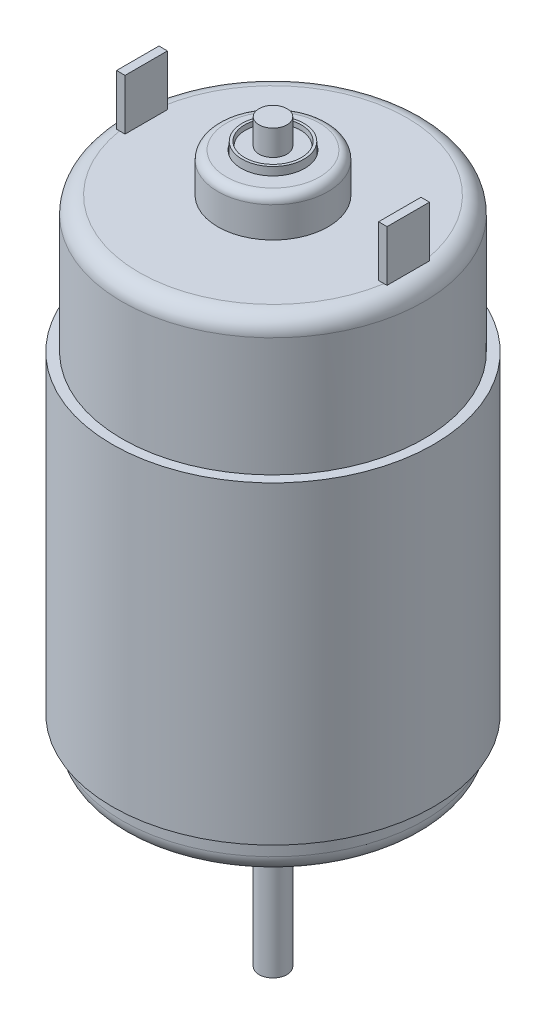
ISO-10303-21;
HEADER;
FILE_DESCRIPTION(('STEP AP214'),'2;1');
FILE_NAME('part.step','',(''),(''),'','','');
FILE_SCHEMA(('AUTOMOTIVE_DESIGN { 1 0 10303 214 1 1 1 1 }'));
ENDSEC;
DATA;
#1=APPLICATION_CONTEXT('core data for automotive mechanical design processes');
#2=APPLICATION_PROTOCOL_DEFINITION('international standard','automotive_design',2000,#1);
#3=PRODUCT_CONTEXT('',#1,'mechanical');
#4=PRODUCT('Part','Part','',(#3));
#5=PRODUCT_RELATED_PRODUCT_CATEGORY('part','',(#4));
#6=PRODUCT_DEFINITION_FORMATION('','',#4);
#7=PRODUCT_DEFINITION_CONTEXT('part definition',#1,'design');
#8=PRODUCT_DEFINITION('design','',#6,#7);
#9=PRODUCT_DEFINITION_SHAPE('','',#8);
#10=(LENGTH_UNIT() NAMED_UNIT(*) SI_UNIT(.MILLI.,.METRE.));
#11=(NAMED_UNIT(*) PLANE_ANGLE_UNIT() SI_UNIT($,.RADIAN.));
#12=(NAMED_UNIT(*) SI_UNIT($,.STERADIAN.) SOLID_ANGLE_UNIT());
#13=UNCERTAINTY_MEASURE_WITH_UNIT(LENGTH_MEASURE(1.E-05),#10,'distance_accuracy_value','');
#14=(GEOMETRIC_REPRESENTATION_CONTEXT(3) GLOBAL_UNCERTAINTY_ASSIGNED_CONTEXT((#13)) GLOBAL_UNIT_ASSIGNED_CONTEXT((#10,
#11,#12)) REPRESENTATION_CONTEXT('',''));
#15=CARTESIAN_POINT('',(0.,0.,0.));
#16=DIRECTION('',(0.,0.,1.));
#17=DIRECTION('',(1.,0.,0.));
#18=AXIS2_PLACEMENT_3D('',#15,#16,#17);
#19=CARTESIAN_POINT('',(0.,57.,0.));
#20=DIRECTION('',(0.,1.,0.));
#21=DIRECTION('',(0.,0.,1.));
#22=AXIS2_PLACEMENT_3D('',#19,#20,#21);
#23=PLANE('',#22);
#24=CARTESIAN_POINT('',(0.,57.,0.));
#25=DIRECTION('',(0.,1.,0.));
#26=DIRECTION('',(0.,0.,1.));
#27=AXIS2_PLACEMENT_3D('',#24,#25,#26);
#28=CIRCLE('',#27,6.5);
#29=CARTESIAN_POINT('',(0.,57.,6.5));
#30=VERTEX_POINT('',#29);
#31=EDGE_CURVE('E221',#30,#30,#28,.T.);
#32=ORIENTED_EDGE('',*,*,#31,.F.);
#33=EDGE_LOOP('',(#32));
#34=FACE_BOUND('',#33,.T.);
#35=DIRECTION('',(0.,0.,-1.));
#36=VECTOR('',#35,1.);
#37=CARTESIAN_POINT('',(-14.95,57.,-2.5));
#38=LINE('',#37,#36);
#39=CARTESIAN_POINT('',(-14.95,57.,2.5));
#40=VERTEX_POINT('',#39);
#41=CARTESIAN_POINT('',(-14.95,57.,-2.5));
#42=VERTEX_POINT('',#41);
#43=EDGE_CURVE('E50',#40,#42,#38,.T.);
#44=ORIENTED_EDGE('',*,*,#43,.F.);
#45=DIRECTION('',(1.,0.,0.));
#46=VECTOR('',#45,1.);
#47=CARTESIAN_POINT('',(-15.95,57.,2.5));
#48=LINE('',#47,#46);
#49=CARTESIAN_POINT('',(-15.6009615088302,57.,2.5));
#50=VERTEX_POINT('',#49);
#51=EDGE_CURVE('E310',#50,#40,#48,.T.);
#52=ORIENTED_EDGE('',*,*,#51,.F.);
#53=CARTESIAN_POINT('',(0.,57.,0.));
#54=DIRECTION('',(0.,1.,0.));
#55=DIRECTION('',(0.,0.,1.));
#56=AXIS2_PLACEMENT_3D('',#53,#54,#55);
#57=CIRCLE('',#56,15.8);
#58=CARTESIAN_POINT('',(15.6009615088302,57.,2.5));
#59=VERTEX_POINT('',#58);
#60=EDGE_CURVE('E233',#50,#59,#57,.T.);
#61=ORIENTED_EDGE('',*,*,#60,.T.);
#62=DIRECTION('',(1.,0.,0.));
#63=VECTOR('',#62,1.);
#64=CARTESIAN_POINT('',(15.95,57.,2.5));
#65=LINE('',#64,#63);
#66=CARTESIAN_POINT('',(14.95,57.,2.5));
#67=VERTEX_POINT('',#66);
#68=EDGE_CURVE('E157',#67,#59,#65,.T.);
#69=ORIENTED_EDGE('',*,*,#68,.F.);
#70=DIRECTION('',(0.,0.,1.));
#71=VECTOR('',#70,1.);
#72=CARTESIAN_POINT('',(14.95,57.,-2.5));
#73=LINE('',#72,#71);
#74=CARTESIAN_POINT('',(14.95,57.,-2.5));
#75=VERTEX_POINT('',#74);
#76=EDGE_CURVE('E137',#75,#67,#73,.T.);
#77=ORIENTED_EDGE('',*,*,#76,.F.);
#78=DIRECTION('',(-1.,0.,0.));
#79=VECTOR('',#78,1.);
#80=CARTESIAN_POINT('',(15.95,57.,-2.5));
#81=LINE('',#80,#79);
#82=CARTESIAN_POINT('',(15.6009615088302,57.,-2.5));
#83=VERTEX_POINT('',#82);
#84=EDGE_CURVE('E162',#83,#75,#81,.T.);
#85=ORIENTED_EDGE('',*,*,#84,.F.);
#86=CARTESIAN_POINT('',(-15.6009615088302,57.,-2.5));
#87=VERTEX_POINT('',#86);
#88=EDGE_CURVE('E238',#83,#87,#57,.T.);
#89=ORIENTED_EDGE('',*,*,#88,.T.);
#90=DIRECTION('',(-1.,0.,0.));
#91=VECTOR('',#90,1.);
#92=CARTESIAN_POINT('',(-15.95,57.,-2.5));
#93=LINE('',#92,#91);
#94=EDGE_CURVE('E55',#42,#87,#93,.T.);
#95=ORIENTED_EDGE('',*,*,#94,.F.);
#96=EDGE_LOOP('',(#44,#52,#61,#69,#77,#85,#89,#95));
#97=FACE_BOUND('',#96,.T.);
#98=ADVANCED_FACE('F35',(#34,#97),#23,.T.);
#99=CARTESIAN_POINT('',(0.,57.,0.));
#100=DIRECTION('',(0.,-1.,0.));
#101=DIRECTION('',(0.,0.,-1.));
#102=AXIS2_PLACEMENT_3D('',#99,#100,#101);
#103=CYLINDRICAL_SURFACE('',#102,17.8);
#104=CARTESIAN_POINT('',(0.,41.,0.));
#105=DIRECTION('',(0.,1.,0.));
#106=DIRECTION('',(0.,0.,1.));
#107=AXIS2_PLACEMENT_3D('',#104,#105,#106);
#108=CIRCLE('',#107,17.8);
#109=CARTESIAN_POINT('',(0.,41.,-17.8));
#110=VERTEX_POINT('',#109);
#111=EDGE_CURVE('E186',#110,#110,#108,.T.);
#112=CARTESIAN_POINT('',(0.,55.,0.));
#113=DIRECTION('',(0.,1.,0.));
#114=DIRECTION('',(0.,0.,1.));
#115=AXIS2_PLACEMENT_3D('',#112,#113,#114);
#116=CIRCLE('',#115,17.8);
#117=CARTESIAN_POINT('',(0.,55.,-17.8));
#118=VERTEX_POINT('',#117);
#119=EDGE_CURVE('E224',#118,#118,#116,.F.);
#120=CARTESIAN_POINT('',(0.,41.,-17.8));
#121=CARTESIAN_POINT('',(0.,41.1458333333333,-17.8));
#122=CARTESIAN_POINT('',(0.,41.2916666666667,-17.8));
#123=CARTESIAN_POINT('',(0.,41.5833333333333,-17.8));
#124=CARTESIAN_POINT('',(0.,41.7291666666667,-17.8));
#125=CARTESIAN_POINT('',(0.,42.0208333333333,-17.8));
#126=CARTESIAN_POINT('',(0.,42.1666666666667,-17.8));
#127=CARTESIAN_POINT('',(0.,42.4583333333333,-17.8));
#128=CARTESIAN_POINT('',(0.,42.6041666666667,-17.8));
#129=CARTESIAN_POINT('',(0.,42.8958333333333,-17.8));
#130=CARTESIAN_POINT('',(0.,43.0416666666667,-17.8));
#131=CARTESIAN_POINT('',(0.,43.3333333333333,-17.8));
#132=CARTESIAN_POINT('',(0.,43.4791666666667,-17.8));
#133=CARTESIAN_POINT('',(0.,43.7708333333333,-17.8));
#134=CARTESIAN_POINT('',(0.,43.9166666666667,-17.8));
#135=CARTESIAN_POINT('',(0.,44.2083333333333,-17.8));
#136=CARTESIAN_POINT('',(0.,44.3541666666667,-17.8));
#137=CARTESIAN_POINT('',(0.,44.6458333333333,-17.8));
#138=CARTESIAN_POINT('',(0.,44.7916666666667,-17.8));
#139=CARTESIAN_POINT('',(0.,45.0833333333333,-17.8));
#140=CARTESIAN_POINT('',(0.,45.2291666666667,-17.8));
#141=CARTESIAN_POINT('',(0.,45.5208333333333,-17.8));
#142=CARTESIAN_POINT('',(0.,45.6666666666667,-17.8));
#143=CARTESIAN_POINT('',(0.,45.9583333333333,-17.8));
#144=CARTESIAN_POINT('',(0.,46.1041666666667,-17.8));
#145=CARTESIAN_POINT('',(0.,46.3958333333333,-17.8));
#146=CARTESIAN_POINT('',(0.,46.5416666666667,-17.8));
#147=CARTESIAN_POINT('',(0.,46.8333333333333,-17.8));
#148=CARTESIAN_POINT('',(0.,46.9791666666667,-17.8));
#149=CARTESIAN_POINT('',(0.,47.2708333333333,-17.8));
#150=CARTESIAN_POINT('',(0.,47.4166666666667,-17.8));
#151=CARTESIAN_POINT('',(0.,47.7083333333333,-17.8));
#152=CARTESIAN_POINT('',(0.,47.8541666666667,-17.8));
#153=CARTESIAN_POINT('',(0.,48.1458333333333,-17.8));
#154=CARTESIAN_POINT('',(0.,48.2916666666667,-17.8));
#155=CARTESIAN_POINT('',(0.,48.5833333333333,-17.8));
#156=CARTESIAN_POINT('',(0.,48.7291666666667,-17.8));
#157=CARTESIAN_POINT('',(0.,49.0208333333333,-17.8));
#158=CARTESIAN_POINT('',(0.,49.1666666666667,-17.8));
#159=CARTESIAN_POINT('',(0.,49.4583333333333,-17.8));
#160=CARTESIAN_POINT('',(0.,49.6041666666667,-17.8));
#161=CARTESIAN_POINT('',(0.,49.8958333333333,-17.8));
#162=CARTESIAN_POINT('',(0.,50.0416666666667,-17.8));
#163=CARTESIAN_POINT('',(0.,50.3333333333333,-17.8));
#164=CARTESIAN_POINT('',(0.,50.4791666666667,-17.8));
#165=CARTESIAN_POINT('',(0.,50.7708333333333,-17.8));
#166=CARTESIAN_POINT('',(0.,50.9166666666667,-17.8));
#167=CARTESIAN_POINT('',(0.,51.2083333333333,-17.8));
#168=CARTESIAN_POINT('',(0.,51.3541666666667,-17.8));
#169=CARTESIAN_POINT('',(0.,51.6458333333333,-17.8));
#170=CARTESIAN_POINT('',(0.,51.7916666666667,-17.8));
#171=CARTESIAN_POINT('',(0.,52.0833333333333,-17.8));
#172=CARTESIAN_POINT('',(0.,52.2291666666667,-17.8));
#173=CARTESIAN_POINT('',(0.,52.5208333333333,-17.8));
#174=CARTESIAN_POINT('',(0.,52.6666666666667,-17.8));
#175=CARTESIAN_POINT('',(0.,52.9583333333333,-17.8));
#176=CARTESIAN_POINT('',(0.,53.1041666666667,-17.8));
#177=CARTESIAN_POINT('',(0.,53.3958333333333,-17.8));
#178=CARTESIAN_POINT('',(0.,53.5416666666667,-17.8));
#179=CARTESIAN_POINT('',(0.,53.8333333333333,-17.8));
#180=CARTESIAN_POINT('',(0.,53.9791666666667,-17.8));
#181=CARTESIAN_POINT('',(0.,54.2708333333333,-17.8));
#182=CARTESIAN_POINT('',(0.,54.4166666666667,-17.8));
#183=CARTESIAN_POINT('',(0.,54.7083333333333,-17.8));
#184=CARTESIAN_POINT('',(0.,54.8541666666667,-17.8));
#185=CARTESIAN_POINT('',(0.,55.,-17.8));
#186=B_SPLINE_CURVE_WITH_KNOTS('',3,(#120,#121,#122,#123,#124,#125,#126,#127,#128,#129,#130,
#131,#132,#133,#134,#135,#136,#137,#138,#139,#140,#141,#142,#143,#144,#145,#146,#147,#148,#149,
#150,#151,#152,#153,#154,#155,#156,#157,#158,#159,#160,#161,#162,#163,#164,#165,#166,#167,#168,
#169,#170,#171,#172,#173,#174,#175,#176,#177,#178,#179,#180,#181,#182,#183,#184,#185),
.UNSPECIFIED.,.F.,.F.,(4,2,2,2,2,2,2,2,2,2,2,2,2,2,2,2,2,2,2,2,2,2,2,2,2,2,2,2,2,2,2,2,4),(0.,
0.4375,0.875000000000001,1.3125,1.75,2.1875,2.625,3.0625,3.5,3.9375,4.375,4.8125,5.25,
5.68750000000001,6.12500000000001,6.5625,7.00000000000001,7.4375,7.87500000000001,8.3125,8.75,
9.1875,9.625,10.0625,10.5,10.9375,11.375,11.8125,12.25,12.6875,13.125,13.5625,14.),.UNSPECIFIED.);
#187=EDGE_CURVE('BSEAM268',#110,#118,#186,.T.);
#188=ORIENTED_EDGE('',*,*,#111,.T.);
#189=ORIENTED_EDGE('',*,*,#119,.T.);
#190=ORIENTED_EDGE('',*,*,#187,.T.);
#191=ORIENTED_EDGE('',*,*,#187,.F.);
#192=EDGE_LOOP('',(#188,#190,#189,#191));
#193=FACE_BOUND('',#192,.T.);
#194=ADVANCED_FACE('F268',(#193),#103,.T.);
#195=CARTESIAN_POINT('',(0.,55.,0.));
#196=DIRECTION('',(0.,1.,0.));
#197=DIRECTION('',(0.,0.,1.));
#198=AXIS2_PLACEMENT_3D('',#195,#196,#197);
#199=TOROIDAL_SURFACE('',#198,15.8,2.);
#200=ORIENTED_EDGE('',*,*,#119,.F.);
#201=EDGE_LOOP('',(#200));
#202=FACE_BOUND('',#201,.T.);
#203=EDGE_CURVE('E234',#59,#83,#57,.T.);
#204=ORIENTED_EDGE('',*,*,#203,.F.);
#205=ORIENTED_EDGE('',*,*,#60,.F.);
#206=EDGE_CURVE('E312',#87,#50,#57,.T.);
#207=ORIENTED_EDGE('',*,*,#206,.F.);
#208=ORIENTED_EDGE('',*,*,#88,.F.);
#209=EDGE_LOOP('',(#204,#205,#207,#208));
#210=FACE_BOUND('',#209,.T.);
#211=ADVANCED_FACE('F274',(#202,#210),#199,.T.);
#212=CARTESIAN_POINT('',(0.,61.6,0.));
#213=DIRECTION('',(0.,1.,0.));
#214=DIRECTION('',(0.,0.,1.));
#215=AXIS2_PLACEMENT_3D('',#212,#213,#214);
#216=PLANE('',#215);
#217=CARTESIAN_POINT('',(0.,61.6,0.));
#218=DIRECTION('',(0.,1.,0.));
#219=DIRECTION('',(0.,0.,1.));
#220=AXIS2_PLACEMENT_3D('',#217,#218,#219);
#221=CIRCLE('',#220,5.5);
#222=CARTESIAN_POINT('',(0.,61.6,5.5));
#223=VERTEX_POINT('',#222);
#224=EDGE_CURVE('E43',#223,#223,#221,.T.);
#225=ORIENTED_EDGE('',*,*,#224,.T.);
#226=EDGE_LOOP('',(#225));
#227=FACE_BOUND('',#226,.T.);
#228=CARTESIAN_POINT('',(0.,61.6,0.));
#229=DIRECTION('',(0.,1.,0.));
#230=DIRECTION('',(0.,0.,1.));
#231=AXIS2_PLACEMENT_3D('',#228,#229,#230);
#232=CIRCLE('',#231,3.75);
#233=CARTESIAN_POINT('',(0.,61.6,3.75));
#234=VERTEX_POINT('',#233);
#235=EDGE_CURVE('E216',#234,#234,#232,.T.);
#236=ORIENTED_EDGE('',*,*,#235,.F.);
#237=EDGE_LOOP('',(#236));
#238=FACE_BOUND('',#237,.T.);
#239=ADVANCED_FACE('F249',(#227,#238),#216,.T.);
#240=CARTESIAN_POINT('',(0.,61.6,0.));
#241=DIRECTION('',(0.,-1.,0.));
#242=DIRECTION('',(0.,0.,-1.));
#243=AXIS2_PLACEMENT_3D('',#240,#241,#242);
#244=CYLINDRICAL_SURFACE('',#243,6.5);
#245=CARTESIAN_POINT('',(0.,60.6,0.));
#246=DIRECTION('',(0.,1.,0.));
#247=DIRECTION('',(0.,0.,1.));
#248=AXIS2_PLACEMENT_3D('',#245,#246,#247);
#249=CIRCLE('',#248,6.5);
#250=CARTESIAN_POINT('',(0.,60.6,6.5));
#251=VERTEX_POINT('',#250);
#252=EDGE_CURVE('E11',#251,#251,#249,.F.);
#253=ORIENTED_EDGE('',*,*,#252,.T.);
#254=EDGE_LOOP('',(#253));
#255=FACE_BOUND('',#254,.T.);
#256=ORIENTED_EDGE('',*,*,#31,.T.);
#257=EDGE_LOOP('',(#256));
#258=FACE_BOUND('',#257,.T.);
#259=ADVANCED_FACE('F281',(#255,#258),#244,.T.);
#260=CARTESIAN_POINT('',(0.,61.6,0.));
#261=DIRECTION('',(0.,-1.,0.));
#262=DIRECTION('',(0.,0.,-1.));
#263=AXIS2_PLACEMENT_3D('',#260,#261,#262);
#264=CYLINDRICAL_SURFACE('',#263,3.75);
#265=ORIENTED_EDGE('',*,*,#235,.T.);
#266=EDGE_LOOP('',(#265));
#267=FACE_BOUND('',#266,.T.);
#268=CARTESIAN_POINT('',(0.,57.,0.));
#269=DIRECTION('',(0.,1.,0.));
#270=DIRECTION('',(0.,0.,1.));
#271=AXIS2_PLACEMENT_3D('',#268,#269,#270);
#272=CIRCLE('',#271,3.75);
#273=CARTESIAN_POINT('',(0.,57.,3.75));
#274=VERTEX_POINT('',#273);
#275=EDGE_CURVE('E210',#274,#274,#272,.T.);
#276=ORIENTED_EDGE('',*,*,#275,.F.);
#277=EDGE_LOOP('',(#276));
#278=FACE_BOUND('',#277,.T.);
#279=ADVANCED_FACE('F410',(#267,#278),#264,.F.);
#280=CARTESIAN_POINT('',(0.,62.5,0.));
#281=DIRECTION('',(0.,1.,0.));
#282=DIRECTION('',(0.,0.,1.));
#283=AXIS2_PLACEMENT_3D('',#280,#281,#282);
#284=PLANE('',#283);
#285=CARTESIAN_POINT('',(0.,62.5,0.));
#286=DIRECTION('',(0.,1.,0.));
#287=DIRECTION('',(0.,0.,1.));
#288=AXIS2_PLACEMENT_3D('',#285,#286,#287);
#289=CIRCLE('',#288,3.6539971428948);
#290=CARTESIAN_POINT('',(0.,62.5,3.6539971428948));
#291=VERTEX_POINT('',#290);
#292=EDGE_CURVE('E213',#291,#291,#289,.T.);
#293=ORIENTED_EDGE('',*,*,#292,.T.);
#294=EDGE_LOOP('',(#293));
#295=FACE_BOUND('',#294,.T.);
#296=CARTESIAN_POINT('',(0.,62.5,0.));
#297=DIRECTION('',(0.,1.,0.));
#298=DIRECTION('',(0.,0.,1.));
#299=AXIS2_PLACEMENT_3D('',#296,#297,#298);
#300=CIRCLE('',#299,3.3460028571052);
#301=CARTESIAN_POINT('',(0.,62.5,3.3460028571052));
#302=VERTEX_POINT('',#301);
#303=EDGE_CURVE('E209',#302,#302,#300,.T.);
#304=ORIENTED_EDGE('',*,*,#303,.F.);
#305=EDGE_LOOP('',(#304));
#306=FACE_BOUND('',#305,.T.);
#307=ADVANCED_FACE('F406',(#295,#306),#284,.T.);
#308=CARTESIAN_POINT('',(0.,57.,0.));
#309=DIRECTION('',(0.,-1.,0.));
#310=DIRECTION('',(0.,0.,1.));
#311=AXIS2_PLACEMENT_3D('',#308,#309,#310);
#312=CONICAL_SURFACE('',#311,3.75,0.0174532925199433);
#313=ORIENTED_EDGE('',*,*,#292,.F.);
#314=EDGE_LOOP('',(#313));
#315=FACE_BOUND('',#314,.T.);
#316=ORIENTED_EDGE('',*,*,#275,.T.);
#317=EDGE_LOOP('',(#316));
#318=FACE_BOUND('',#317,.T.);
#319=ADVANCED_FACE('F409',(#315,#318),#312,.T.);
#320=CARTESIAN_POINT('',(0.,57.,0.));
#321=DIRECTION('',(0.,1.,0.));
#322=DIRECTION('',(0.,0.,1.));
#323=AXIS2_PLACEMENT_3D('',#320,#321,#322);
#324=CONICAL_SURFACE('',#323,3.25,0.0174532925199433);
#325=ORIENTED_EDGE('',*,*,#303,.T.);
#326=EDGE_LOOP('',(#325));
#327=FACE_BOUND('',#326,.T.);
#328=CARTESIAN_POINT('',(0.,57.,0.));
#329=DIRECTION('',(0.,1.,0.));
#330=DIRECTION('',(0.,0.,1.));
#331=AXIS2_PLACEMENT_3D('',#328,#329,#330);
#332=CIRCLE('',#331,3.25);
#333=CARTESIAN_POINT('',(0.,57.,3.25));
#334=VERTEX_POINT('',#333);
#335=EDGE_CURVE('E180',#334,#334,#332,.T.);
#336=ORIENTED_EDGE('',*,*,#335,.F.);
#337=EDGE_LOOP('',(#336));
#338=FACE_BOUND('',#337,.T.);
#339=ADVANCED_FACE('F382',(#327,#338),#324,.F.);
#340=CARTESIAN_POINT('',(0.,4.,0.));
#341=DIRECTION('',(0.,1.,0.));
#342=DIRECTION('',(0.,0.,1.));
#343=AXIS2_PLACEMENT_3D('',#340,#341,#342);
#344=CYLINDRICAL_SURFACE('',#343,18.95);
#345=CARTESIAN_POINT('',(0.,4.,0.));
#346=DIRECTION('',(0.,1.,0.));
#347=DIRECTION('',(0.,0.,1.));
#348=AXIS2_PLACEMENT_3D('',#345,#346,#347);
#349=CIRCLE('',#348,18.95);
#350=CARTESIAN_POINT('',(0.,4.,18.95));
#351=VERTEX_POINT('',#350);
#352=EDGE_CURVE('E192',#351,#351,#349,.T.);
#353=ORIENTED_EDGE('',*,*,#352,.T.);
#354=EDGE_LOOP('',(#353));
#355=FACE_BOUND('',#354,.T.);
#356=CARTESIAN_POINT('',(0.,41.,0.));
#357=DIRECTION('',(0.,1.,0.));
#358=DIRECTION('',(0.,0.,1.));
#359=AXIS2_PLACEMENT_3D('',#356,#357,#358);
#360=CIRCLE('',#359,18.95);
#361=CARTESIAN_POINT('',(0.,41.,18.95));
#362=VERTEX_POINT('',#361);
#363=EDGE_CURVE('E191',#362,#362,#360,.T.);
#364=ORIENTED_EDGE('',*,*,#363,.F.);
#365=EDGE_LOOP('',(#364));
#366=FACE_BOUND('',#365,.T.);
#367=ADVANCED_FACE('F374',(#355,#366),#344,.T.);
#368=CARTESIAN_POINT('',(0.,4.,0.));
#369=DIRECTION('',(0.,1.,0.));
#370=DIRECTION('',(0.,0.,1.));
#371=AXIS2_PLACEMENT_3D('',#368,#369,#370);
#372=PLANE('',#371);
#373=CARTESIAN_POINT('',(0.,4.,0.));
#374=DIRECTION('',(0.,1.,0.));
#375=DIRECTION('',(0.,0.,1.));
#376=AXIS2_PLACEMENT_3D('',#373,#374,#375);
#377=CIRCLE('',#376,17.8);
#378=CARTESIAN_POINT('',(0.,4.,-17.8));
#379=VERTEX_POINT('',#378);
#380=EDGE_CURVE('E244',#379,#379,#377,.T.);
#381=ORIENTED_EDGE('',*,*,#380,.T.);
#382=EDGE_LOOP('',(#381));
#383=FACE_BOUND('',#382,.T.);
#384=ORIENTED_EDGE('',*,*,#352,.F.);
#385=EDGE_LOOP('',(#384));
#386=FACE_BOUND('',#385,.T.);
#387=ADVANCED_FACE('F370',(#383,#386),#372,.F.);
#388=CARTESIAN_POINT('',(0.,41.,0.));
#389=DIRECTION('',(0.,1.,0.));
#390=DIRECTION('',(0.,0.,1.));
#391=AXIS2_PLACEMENT_3D('',#388,#389,#390);
#392=PLANE('',#391);
#393=ORIENTED_EDGE('',*,*,#111,.F.);
#394=EDGE_LOOP('',(#393));
#395=FACE_BOUND('',#394,.T.);
#396=ORIENTED_EDGE('',*,*,#363,.T.);
#397=EDGE_LOOP('',(#396));
#398=FACE_BOUND('',#397,.T.);
#399=ADVANCED_FACE('F373',(#395,#398),#392,.T.);
#400=CARTESIAN_POINT('',(0.,-21.8,0.));
#401=DIRECTION('',(0.,-1.,0.));
#402=DIRECTION('',(0.,0.,-1.));
#403=AXIS2_PLACEMENT_3D('',#400,#401,#402);
#404=PLANE('',#403);
#405=CARTESIAN_POINT('',(0.,-21.8,0.));
#406=DIRECTION('',(0.,-1.,0.));
#407=DIRECTION('',(0.,0.,-1.));
#408=AXIS2_PLACEMENT_3D('',#405,#406,#407);
#409=CIRCLE('',#408,1.65);
#410=CARTESIAN_POINT('',(0.,-21.8,1.65));
#411=VERTEX_POINT('',#410);
#412=EDGE_CURVE('E198',#411,#411,#409,.T.);
#413=ORIENTED_EDGE('',*,*,#412,.T.);
#414=EDGE_LOOP('',(#413));
#415=FACE_BOUND('',#414,.T.);
#416=ADVANCED_FACE('F378',(#415),#404,.T.);
#417=CARTESIAN_POINT('',(0.,-21.8,0.));
#418=DIRECTION('',(0.,1.,0.));
#419=DIRECTION('',(0.,0.,1.));
#420=AXIS2_PLACEMENT_3D('',#417,#418,#419);
#421=CYLINDRICAL_SURFACE('',#420,1.65);
#422=CARTESIAN_POINT('',(0.,-4.6,0.));
#423=DIRECTION('',(0.,-1.,0.));
#424=DIRECTION('',(0.,0.,-1.));
#425=AXIS2_PLACEMENT_3D('',#422,#423,#424);
#426=CIRCLE('',#425,1.65);
#427=CARTESIAN_POINT('',(0.,-4.6,1.65));
#428=VERTEX_POINT('',#427);
#429=EDGE_CURVE('E195',#428,#428,#426,.T.);
#430=CARTESIAN_POINT('',(0.,-21.8,1.65));
#431=CARTESIAN_POINT('',(0.,-21.6208333333333,1.65));
#432=CARTESIAN_POINT('',(0.,-21.4416666666667,1.65));
#433=CARTESIAN_POINT('',(0.,-21.0833333333333,1.65));
#434=CARTESIAN_POINT('',(0.,-20.9041666666667,1.65));
#435=CARTESIAN_POINT('',(0.,-20.5458333333333,1.65));
#436=CARTESIAN_POINT('',(0.,-20.3666666666667,1.65));
#437=CARTESIAN_POINT('',(0.,-20.0083333333333,1.65));
#438=CARTESIAN_POINT('',(0.,-19.8291666666667,1.65));
#439=CARTESIAN_POINT('',(0.,-19.4708333333333,1.65));
#440=CARTESIAN_POINT('',(0.,-19.2916666666667,1.65));
#441=CARTESIAN_POINT('',(0.,-18.9333333333333,1.65));
#442=CARTESIAN_POINT('',(0.,-18.7541666666667,1.65));
#443=CARTESIAN_POINT('',(0.,-18.3958333333333,1.65));
#444=CARTESIAN_POINT('',(0.,-18.2166666666667,1.65));
#445=CARTESIAN_POINT('',(0.,-17.8583333333333,1.65));
#446=CARTESIAN_POINT('',(0.,-17.6791666666667,1.65));
#447=CARTESIAN_POINT('',(0.,-17.3208333333333,1.65));
#448=CARTESIAN_POINT('',(0.,-17.1416666666667,1.65));
#449=CARTESIAN_POINT('',(0.,-16.7833333333333,1.65));
#450=CARTESIAN_POINT('',(0.,-16.6041666666667,1.65));
#451=CARTESIAN_POINT('',(0.,-16.2458333333333,1.65));
#452=CARTESIAN_POINT('',(0.,-16.0666666666667,1.65));
#453=CARTESIAN_POINT('',(0.,-15.7083333333333,1.65));
#454=CARTESIAN_POINT('',(0.,-15.5291666666667,1.65));
#455=CARTESIAN_POINT('',(0.,-15.1708333333333,1.65));
#456=CARTESIAN_POINT('',(0.,-14.9916666666667,1.65));
#457=CARTESIAN_POINT('',(0.,-14.6333333333333,1.65));
#458=CARTESIAN_POINT('',(0.,-14.4541666666667,1.65));
#459=CARTESIAN_POINT('',(0.,-14.0958333333333,1.65));
#460=CARTESIAN_POINT('',(0.,-13.9166666666667,1.65));
#461=CARTESIAN_POINT('',(0.,-13.5583333333333,1.65));
#462=CARTESIAN_POINT('',(0.,-13.3791666666667,1.65));
#463=CARTESIAN_POINT('',(0.,-13.0208333333333,1.65));
#464=CARTESIAN_POINT('',(0.,-12.8416666666667,1.65));
#465=CARTESIAN_POINT('',(0.,-12.4833333333333,1.65));
#466=CARTESIAN_POINT('',(0.,-12.3041666666667,1.65));
#467=CARTESIAN_POINT('',(0.,-11.9458333333333,1.65));
#468=CARTESIAN_POINT('',(0.,-11.7666666666667,1.65));
#469=CARTESIAN_POINT('',(0.,-11.4083333333333,1.65));
#470=CARTESIAN_POINT('',(0.,-11.2291666666667,1.65));
#471=CARTESIAN_POINT('',(0.,-10.8708333333333,1.65));
#472=CARTESIAN_POINT('',(0.,-10.6916666666667,1.65));
#473=CARTESIAN_POINT('',(0.,-10.3333333333333,1.65));
#474=CARTESIAN_POINT('',(0.,-10.1541666666667,1.65));
#475=CARTESIAN_POINT('',(0.,-9.79583333333333,1.65));
#476=CARTESIAN_POINT('',(0.,-9.61666666666666,1.65));
#477=CARTESIAN_POINT('',(0.,-9.25833333333333,1.65));
#478=CARTESIAN_POINT('',(0.,-9.07916666666666,1.65));
#479=CARTESIAN_POINT('',(0.,-8.72083333333333,1.65));
#480=CARTESIAN_POINT('',(0.,-8.54166666666666,1.65));
#481=CARTESIAN_POINT('',(0.,-8.18333333333333,1.65));
#482=CARTESIAN_POINT('',(0.,-8.00416666666666,1.65));
#483=CARTESIAN_POINT('',(0.,-7.64583333333333,1.65));
#484=CARTESIAN_POINT('',(0.,-7.46666666666666,1.65));
#485=CARTESIAN_POINT('',(0.,-7.10833333333333,1.65));
#486=CARTESIAN_POINT('',(0.,-6.92916666666666,1.65));
#487=CARTESIAN_POINT('',(0.,-6.57083333333333,1.65));
#488=CARTESIAN_POINT('',(0.,-6.39166666666666,1.65));
#489=CARTESIAN_POINT('',(0.,-6.03333333333333,1.65));
#490=CARTESIAN_POINT('',(0.,-5.85416666666666,1.65));
#491=CARTESIAN_POINT('',(0.,-5.49583333333333,1.65));
#492=CARTESIAN_POINT('',(0.,-5.31666666666666,1.65));
#493=CARTESIAN_POINT('',(0.,-4.95833333333333,1.65));
#494=CARTESIAN_POINT('',(0.,-4.77916666666666,1.65));
#495=CARTESIAN_POINT('',(0.,-4.6,1.65));
#496=B_SPLINE_CURVE_WITH_KNOTS('',3,(#430,#431,#432,#433,#434,#435,#436,#437,#438,#439,#440,
#441,#442,#443,#444,#445,#446,#447,#448,#449,#450,#451,#452,#453,#454,#455,#456,#457,#458,#459,
#460,#461,#462,#463,#464,#465,#466,#467,#468,#469,#470,#471,#472,#473,#474,#475,#476,#477,#478,
#479,#480,#481,#482,#483,#484,#485,#486,#487,#488,#489,#490,#491,#492,#493,#494,#495),
.UNSPECIFIED.,.F.,.F.,(4,2,2,2,2,2,2,2,2,2,2,2,2,2,2,2,2,2,2,2,2,2,2,2,2,2,2,2,2,2,2,2,4),(0.,
0.537500000000003,1.075,1.6125,2.15,2.6875,3.225,3.7625,4.3,4.8375,5.375,5.9125,6.45,6.9875,
7.525,8.0625,8.6,9.1375,9.675,10.2125,10.75,11.2875,11.825,12.3625,12.9,13.4375,13.975,14.5125,
15.05,15.5875,16.125,16.6625,17.2),.UNSPECIFIED.);
#497=EDGE_CURVE('BSEAM386',#411,#428,#496,.T.);
#498=ORIENTED_EDGE('',*,*,#412,.F.);
#499=ORIENTED_EDGE('',*,*,#429,.T.);
#500=ORIENTED_EDGE('',*,*,#497,.T.);
#501=ORIENTED_EDGE('',*,*,#497,.F.);
#502=EDGE_LOOP('',(#498,#500,#499,#501));
#503=FACE_BOUND('',#502,.T.);
#504=ADVANCED_FACE('F386',(#503),#421,.T.);
#505=CARTESIAN_POINT('',(0.,-4.6,0.));
#506=DIRECTION('',(0.,-1.,0.));
#507=DIRECTION('',(0.,0.,-1.));
#508=AXIS2_PLACEMENT_3D('',#505,#506,#507);
#509=PLANE('',#508);
#510=ORIENTED_EDGE('',*,*,#429,.F.);
#511=EDGE_LOOP('',(#510));
#512=FACE_BOUND('',#511,.T.);
#513=CARTESIAN_POINT('',(0.,-4.6,0.));
#514=DIRECTION('',(0.,-1.,0.));
#515=DIRECTION('',(0.,0.,-1.));
#516=AXIS2_PLACEMENT_3D('',#513,#514,#515);
#517=CIRCLE('',#516,5.5);
#518=CARTESIAN_POINT('',(0.,-4.6,-5.5));
#519=VERTEX_POINT('',#518);
#520=EDGE_CURVE('E241',#519,#519,#517,.T.);
#521=ORIENTED_EDGE('',*,*,#520,.T.);
#522=EDGE_LOOP('',(#521));
#523=FACE_BOUND('',#522,.T.);
#524=ADVANCED_FACE('F390',(#512,#523),#509,.T.);
#525=CARTESIAN_POINT('',(0.,-5.,0.));
#526=DIRECTION('',(0.,1.,0.));
#527=DIRECTION('',(0.,0.,1.));
#528=AXIS2_PLACEMENT_3D('',#525,#526,#527);
#529=CYLINDRICAL_SURFACE('',#528,5.5);
#530=ORIENTED_EDGE('',*,*,#520,.F.);
#531=EDGE_LOOP('',(#530));
#532=FACE_BOUND('',#531,.T.);
#533=CARTESIAN_POINT('',(0.,-5.,0.));
#534=DIRECTION('',(0.,-1.,0.));
#535=DIRECTION('',(0.,0.,-1.));
#536=AXIS2_PLACEMENT_3D('',#533,#534,#535);
#537=CIRCLE('',#536,5.5);
#538=CARTESIAN_POINT('',(0.,-5.,-5.5));
#539=VERTEX_POINT('',#538);
#540=EDGE_CURVE('E201',#539,#539,#537,.T.);
#541=ORIENTED_EDGE('',*,*,#540,.T.);
#542=EDGE_LOOP('',(#541));
#543=FACE_BOUND('',#542,.T.);
#544=ADVANCED_FACE('F394',(#532,#543),#529,.F.);
#545=CARTESIAN_POINT('',(0.,-5.,0.));
#546=DIRECTION('',(0.,-1.,0.));
#547=DIRECTION('',(0.,0.,-1.));
#548=AXIS2_PLACEMENT_3D('',#545,#546,#547);
#549=PLANE('',#548);
#550=CARTESIAN_POINT('',(0.,-5.,0.));
#551=DIRECTION('',(0.,-1.,0.));
#552=DIRECTION('',(0.,0.,-1.));
#553=AXIS2_PLACEMENT_3D('',#550,#551,#552);
#554=CIRCLE('',#553,6.5);
#555=CARTESIAN_POINT('',(0.,-5.,-6.5));
#556=VERTEX_POINT('',#555);
#557=EDGE_CURVE('E206',#556,#556,#554,.T.);
#558=ORIENTED_EDGE('',*,*,#557,.T.);
#559=EDGE_LOOP('',(#558));
#560=FACE_BOUND('',#559,.T.);
#561=ORIENTED_EDGE('',*,*,#540,.F.);
#562=EDGE_LOOP('',(#561));
#563=FACE_BOUND('',#562,.T.);
#564=ADVANCED_FACE('F398',(#560,#563),#549,.T.);
#565=CARTESIAN_POINT('',(0.,-5.,0.));
#566=DIRECTION('',(0.,1.,0.));
#567=DIRECTION('',(0.,0.,1.));
#568=AXIS2_PLACEMENT_3D('',#565,#566,#567);
#569=CYLINDRICAL_SURFACE('',#568,6.5);
#570=ORIENTED_EDGE('',*,*,#557,.F.);
#571=EDGE_LOOP('',(#570));
#572=FACE_BOUND('',#571,.T.);
#573=CARTESIAN_POINT('',(0.,0.,0.));
#574=DIRECTION('',(0.,1.,0.));
#575=DIRECTION('',(0.,0.,1.));
#576=AXIS2_PLACEMENT_3D('',#573,#574,#575);
#577=CIRCLE('',#576,6.5);
#578=CARTESIAN_POINT('',(0.,0.,6.5));
#579=VERTEX_POINT('',#578);
#580=EDGE_CURVE('E237',#579,#579,#577,.F.);
#581=ORIENTED_EDGE('',*,*,#580,.T.);
#582=EDGE_LOOP('',(#581));
#583=FACE_BOUND('',#582,.T.);
#584=ADVANCED_FACE('F286',(#572,#583),#569,.T.);
#585=CARTESIAN_POINT('',(0.,0.,0.));
#586=DIRECTION('',(0.,1.,0.));
#587=DIRECTION('',(0.,0.,1.));
#588=AXIS2_PLACEMENT_3D('',#585,#586,#587);
#589=PLANE('',#588);
#590=ORIENTED_EDGE('',*,*,#580,.F.);
#591=EDGE_LOOP('',(#590));
#592=FACE_BOUND('',#591,.T.);
#593=CARTESIAN_POINT('',(0.,0.,0.));
#594=DIRECTION('',(0.,1.,0.));
#595=DIRECTION('',(0.,0.,1.));
#596=AXIS2_PLACEMENT_3D('',#593,#594,#595);
#597=CIRCLE('',#596,15.8);
#598=CARTESIAN_POINT('',(0.,0.,15.8));
#599=VERTEX_POINT('',#598);
#600=EDGE_CURVE('E230',#599,#599,#597,.F.);
#601=ORIENTED_EDGE('',*,*,#600,.T.);
#602=EDGE_LOOP('',(#601));
#603=FACE_BOUND('',#602,.T.);
#604=ADVANCED_FACE('F283',(#592,#603),#589,.F.);
#605=CARTESIAN_POINT('',(0.,2.,0.));
#606=DIRECTION('',(0.,1.,0.));
#607=DIRECTION('',(0.,0.,1.));
#608=AXIS2_PLACEMENT_3D('',#605,#606,#607);
#609=TOROIDAL_SURFACE('',#608,15.8,2.);
#610=ORIENTED_EDGE('',*,*,#600,.F.);
#611=EDGE_LOOP('',(#610));
#612=FACE_BOUND('',#611,.T.);
#613=CARTESIAN_POINT('',(0.,2.,0.));
#614=DIRECTION('',(0.,1.,0.));
#615=DIRECTION('',(0.,0.,1.));
#616=AXIS2_PLACEMENT_3D('',#613,#614,#615);
#617=CIRCLE('',#616,17.8);
#618=CARTESIAN_POINT('',(0.,2.,-17.8));
#619=VERTEX_POINT('',#618);
#620=EDGE_CURVE('E227',#619,#619,#617,.T.);
#621=ORIENTED_EDGE('',*,*,#620,.F.);
#622=EDGE_LOOP('',(#621));
#623=FACE_BOUND('',#622,.T.);
#624=ADVANCED_FACE('F285',(#612,#623),#609,.T.);
#625=CARTESIAN_POINT('',(0.,2.,-17.8));
#626=CARTESIAN_POINT('',(0.,2.02083333333333,-17.8));
#627=CARTESIAN_POINT('',(0.,2.04166666666667,-17.8));
#628=CARTESIAN_POINT('',(0.,2.08333333333334,-17.8));
#629=CARTESIAN_POINT('',(0.,2.10416666666667,-17.8));
#630=CARTESIAN_POINT('',(0.,2.14583333333334,-17.8));
#631=CARTESIAN_POINT('',(0.,2.16666666666667,-17.8));
#632=CARTESIAN_POINT('',(0.,2.20833333333334,-17.8));
#633=CARTESIAN_POINT('',(0.,2.22916666666667,-17.8));
#634=CARTESIAN_POINT('',(0.,2.27083333333334,-17.8));
#635=CARTESIAN_POINT('',(0.,2.29166666666667,-17.8));
#636=CARTESIAN_POINT('',(0.,2.33333333333334,-17.8));
#637=CARTESIAN_POINT('',(0.,2.35416666666667,-17.8));
#638=CARTESIAN_POINT('',(0.,2.39583333333334,-17.8));
#639=CARTESIAN_POINT('',(0.,2.41666666666667,-17.8));
#640=CARTESIAN_POINT('',(0.,2.45833333333334,-17.8));
#641=CARTESIAN_POINT('',(0.,2.47916666666667,-17.8));
#642=CARTESIAN_POINT('',(0.,2.52083333333334,-17.8));
#643=CARTESIAN_POINT('',(0.,2.54166666666667,-17.8));
#644=CARTESIAN_POINT('',(0.,2.58333333333334,-17.8));
#645=CARTESIAN_POINT('',(0.,2.60416666666667,-17.8));
#646=CARTESIAN_POINT('',(0.,2.64583333333334,-17.8));
#647=CARTESIAN_POINT('',(0.,2.66666666666667,-17.8));
#648=CARTESIAN_POINT('',(0.,2.70833333333334,-17.8));
#649=CARTESIAN_POINT('',(0.,2.72916666666667,-17.8));
#650=CARTESIAN_POINT('',(0.,2.77083333333334,-17.8));
#651=CARTESIAN_POINT('',(0.,2.79166666666667,-17.8));
#652=CARTESIAN_POINT('',(0.,2.83333333333334,-17.8));
#653=CARTESIAN_POINT('',(0.,2.85416666666667,-17.8));
#654=CARTESIAN_POINT('',(0.,2.89583333333334,-17.8));
#655=CARTESIAN_POINT('',(0.,2.91666666666667,-17.8));
#656=CARTESIAN_POINT('',(0.,2.95833333333334,-17.8));
#657=CARTESIAN_POINT('',(0.,2.97916666666667,-17.8));
#658=CARTESIAN_POINT('',(0.,3.02083333333334,-17.8));
#659=CARTESIAN_POINT('',(0.,3.04166666666667,-17.8));
#660=CARTESIAN_POINT('',(0.,3.08333333333334,-17.8));
#661=CARTESIAN_POINT('',(0.,3.10416666666667,-17.8));
#662=CARTESIAN_POINT('',(0.,3.14583333333334,-17.8));
#663=CARTESIAN_POINT('',(0.,3.16666666666667,-17.8));
#664=CARTESIAN_POINT('',(0.,3.20833333333334,-17.8));
#665=CARTESIAN_POINT('',(0.,3.22916666666667,-17.8));
#666=CARTESIAN_POINT('',(0.,3.27083333333334,-17.8));
#667=CARTESIAN_POINT('',(0.,3.29166666666667,-17.8));
#668=CARTESIAN_POINT('',(0.,3.33333333333334,-17.8));
#669=CARTESIAN_POINT('',(0.,3.35416666666667,-17.8));
#670=CARTESIAN_POINT('',(0.,3.39583333333334,-17.8));
#671=CARTESIAN_POINT('',(0.,3.41666666666667,-17.8));
#672=CARTESIAN_POINT('',(0.,3.45833333333334,-17.8));
#673=CARTESIAN_POINT('',(0.,3.47916666666667,-17.8));
#674=CARTESIAN_POINT('',(0.,3.52083333333334,-17.8));
#675=CARTESIAN_POINT('',(0.,3.54166666666667,-17.8));
#676=CARTESIAN_POINT('',(0.,3.58333333333334,-17.8));
#677=CARTESIAN_POINT('',(0.,3.60416666666667,-17.8));
#678=CARTESIAN_POINT('',(0.,3.64583333333334,-17.8));
#679=CARTESIAN_POINT('',(0.,3.66666666666667,-17.8));
#680=CARTESIAN_POINT('',(0.,3.70833333333334,-17.8));
#681=CARTESIAN_POINT('',(0.,3.72916666666667,-17.8));
#682=CARTESIAN_POINT('',(0.,3.77083333333334,-17.8));
#683=CARTESIAN_POINT('',(0.,3.79166666666667,-17.8));
#684=CARTESIAN_POINT('',(0.,3.83333333333334,-17.8));
#685=CARTESIAN_POINT('',(0.,3.85416666666667,-17.8));
#686=CARTESIAN_POINT('',(0.,3.89583333333334,-17.8));
#687=CARTESIAN_POINT('',(0.,3.91666666666667,-17.8));
#688=CARTESIAN_POINT('',(0.,3.95833333333334,-17.8));
#689=CARTESIAN_POINT('',(0.,3.97916666666667,-17.8));
#690=CARTESIAN_POINT('',(0.,4.,-17.8));
#691=B_SPLINE_CURVE_WITH_KNOTS('',3,(#625,#626,#627,#628,#629,#630,#631,#632,#633,#634,#635,
#636,#637,#638,#639,#640,#641,#642,#643,#644,#645,#646,#647,#648,#649,#650,#651,#652,#653,#654,
#655,#656,#657,#658,#659,#660,#661,#662,#663,#664,#665,#666,#667,#668,#669,#670,#671,#672,#673,
#674,#675,#676,#677,#678,#679,#680,#681,#682,#683,#684,#685,#686,#687,#688,#689,#690),
.UNSPECIFIED.,.F.,.F.,(4,2,2,2,2,2,2,2,2,2,2,2,2,2,2,2,2,2,2,2,2,2,2,2,2,2,2,2,2,2,2,2,4),(0.,
0.0625000000000001,0.125,0.1875,0.25,0.3125,0.375,0.4375,0.5,0.5625,0.625000000000001,
0.687500000000001,0.750000000000001,0.812500000000001,0.875000000000001,0.937500000000001,1.,
1.0625,1.125,1.1875,1.25,1.3125,1.375,1.4375,1.5,1.5625,1.625,1.6875,1.75,1.8125,1.875,1.9375,
2.),.UNSPECIFIED.);
#692=EDGE_CURVE('BSEAM277',#619,#379,#691,.T.);
#693=ORIENTED_EDGE('',*,*,#620,.T.);
#694=ORIENTED_EDGE('',*,*,#380,.F.);
#695=ORIENTED_EDGE('',*,*,#692,.T.);
#696=ORIENTED_EDGE('',*,*,#692,.F.);
#697=EDGE_LOOP('',(#693,#695,#694,#696));
#698=FACE_BOUND('',#697,.T.);
#699=ADVANCED_FACE('F277',(#698),#103,.T.);
#700=CARTESIAN_POINT('',(0.,62.,0.));
#701=DIRECTION('',(0.,-1.,0.));
#702=DIRECTION('',(0.,0.,-1.));
#703=AXIS2_PLACEMENT_3D('',#700,#701,#702);
#704=CYLINDRICAL_SURFACE('',#703,3.25);
#705=CARTESIAN_POINT('',(0.,62.,0.));
#706=DIRECTION('',(0.,1.,0.));
#707=DIRECTION('',(0.,0.,1.));
#708=AXIS2_PLACEMENT_3D('',#705,#706,#707);
#709=CIRCLE('',#708,3.25);
#710=CARTESIAN_POINT('',(0.,62.,3.25));
#711=VERTEX_POINT('',#710);
#712=EDGE_CURVE('E183',#711,#711,#709,.T.);
#713=ORIENTED_EDGE('',*,*,#712,.F.);
#714=EDGE_LOOP('',(#713));
#715=FACE_BOUND('',#714,.T.);
#716=ORIENTED_EDGE('',*,*,#335,.T.);
#717=EDGE_LOOP('',(#716));
#718=FACE_BOUND('',#717,.T.);
#719=ADVANCED_FACE('F263',(#715,#718),#704,.T.);
#720=CARTESIAN_POINT('',(0.,62.,0.));
#721=DIRECTION('',(0.,1.,0.));
#722=DIRECTION('',(0.,0.,1.));
#723=AXIS2_PLACEMENT_3D('',#720,#721,#722);
#724=PLANE('',#723);
#725=CARTESIAN_POINT('',(0.,62.,0.));
#726=DIRECTION('',(0.,1.,0.));
#727=DIRECTION('',(0.,0.,1.));
#728=AXIS2_PLACEMENT_3D('',#725,#726,#727);
#729=CIRCLE('',#728,1.65);
#730=CARTESIAN_POINT('',(0.,62.,1.65));
#731=VERTEX_POINT('',#730);
#732=EDGE_CURVE('E176',#731,#731,#729,.T.);
#733=ORIENTED_EDGE('',*,*,#732,.F.);
#734=EDGE_LOOP('',(#733));
#735=FACE_BOUND('',#734,.T.);
#736=ORIENTED_EDGE('',*,*,#712,.T.);
#737=EDGE_LOOP('',(#736));
#738=FACE_BOUND('',#737,.T.);
#739=ADVANCED_FACE('F254',(#735,#738),#724,.T.);
#740=CARTESIAN_POINT('',(0.,60.6,0.));
#741=DIRECTION('',(0.,1.,0.));
#742=DIRECTION('',(0.,0.,1.));
#743=AXIS2_PLACEMENT_3D('',#740,#741,#742);
#744=TOROIDAL_SURFACE('',#743,5.5,1.);
#745=ORIENTED_EDGE('',*,*,#252,.F.);
#746=EDGE_LOOP('',(#745));
#747=FACE_BOUND('',#746,.T.);
#748=ORIENTED_EDGE('',*,*,#224,.F.);
#749=EDGE_LOOP('',(#748));
#750=FACE_BOUND('',#749,.T.);
#751=ADVANCED_FACE('F37',(#747,#750),#744,.T.);
#752=CARTESIAN_POINT('',(0.,65.,0.));
#753=DIRECTION('',(0.,-1.,0.));
#754=DIRECTION('',(0.,0.,-1.));
#755=AXIS2_PLACEMENT_3D('',#752,#753,#754);
#756=CYLINDRICAL_SURFACE('',#755,1.65);
#757=CARTESIAN_POINT('',(0.,65.,0.));
#758=DIRECTION('',(0.,1.,0.));
#759=DIRECTION('',(0.,0.,1.));
#760=AXIS2_PLACEMENT_3D('',#757,#758,#759);
#761=CIRCLE('',#760,1.65);
#762=CARTESIAN_POINT('',(0.,65.,1.65));
#763=VERTEX_POINT('',#762);
#764=EDGE_CURVE('E177',#763,#763,#761,.T.);
#765=ORIENTED_EDGE('',*,*,#764,.F.);
#766=EDGE_LOOP('',(#765));
#767=FACE_BOUND('',#766,.T.);
#768=ORIENTED_EDGE('',*,*,#732,.T.);
#769=EDGE_LOOP('',(#768));
#770=FACE_BOUND('',#769,.T.);
#771=ADVANCED_FACE('F253',(#767,#770),#756,.T.);
#772=CARTESIAN_POINT('',(0.,65.,0.));
#773=DIRECTION('',(0.,1.,0.));
#774=DIRECTION('',(0.,0.,1.));
#775=AXIS2_PLACEMENT_3D('',#772,#773,#774);
#776=PLANE('',#775);
#777=ORIENTED_EDGE('',*,*,#764,.T.);
#778=EDGE_LOOP('',(#777));
#779=FACE_BOUND('',#778,.T.);
#780=ADVANCED_FACE('F260',(#779),#776,.T.);
#781=CARTESIAN_POINT('',(14.95,63.,-2.5));
#782=DIRECTION('',(1.,0.,0.));
#783=DIRECTION('',(0.,0.,-1.));
#784=AXIS2_PLACEMENT_3D('',#781,#782,#783);
#785=PLANE('',#784);
#786=ORIENTED_EDGE('',*,*,#76,.T.);
#787=DIRECTION('',(0.,-1.,0.));
#788=VECTOR('',#787,1.);
#789=CARTESIAN_POINT('',(14.95,63.,2.5));
#790=LINE('',#789,#788);
#791=CARTESIAN_POINT('',(14.95,63.,2.5));
#792=VERTEX_POINT('',#791);
#793=EDGE_CURVE('E173',#792,#67,#790,.T.);
#794=ORIENTED_EDGE('',*,*,#793,.F.);
#795=DIRECTION('',(0.,0.,1.));
#796=VECTOR('',#795,1.);
#797=CARTESIAN_POINT('',(14.95,63.,-2.5));
#798=LINE('',#797,#796);
#799=CARTESIAN_POINT('',(14.95,63.,-2.5));
#800=VERTEX_POINT('',#799);
#801=EDGE_CURVE('E146',#800,#792,#798,.T.);
#802=ORIENTED_EDGE('',*,*,#801,.F.);
#803=DIRECTION('',(0.,-1.,0.));
#804=VECTOR('',#803,1.);
#805=CARTESIAN_POINT('',(14.95,63.,-2.5));
#806=LINE('',#805,#804);
#807=EDGE_CURVE('E155',#800,#75,#806,.T.);
#808=ORIENTED_EDGE('',*,*,#807,.T.);
#809=EDGE_LOOP('',(#786,#794,#802,#808));
#810=FACE_BOUND('',#809,.T.);
#811=ADVANCED_FACE('F360',(#810),#785,.F.);
#812=CARTESIAN_POINT('',(15.95,63.,2.5));
#813=DIRECTION('',(0.,0.,-1.));
#814=DIRECTION('',(-1.,0.,0.));
#815=AXIS2_PLACEMENT_3D('',#812,#813,#814);
#816=PLANE('',#815);
#817=ORIENTED_EDGE('',*,*,#68,.T.);
#818=CARTESIAN_POINT('',(15.95,57.,2.5));
#819=VERTEX_POINT('',#818);
#820=EDGE_CURVE('E140',#59,#819,#65,.T.);
#821=ORIENTED_EDGE('',*,*,#820,.T.);
#822=DIRECTION('',(0.,-1.,0.));
#823=VECTOR('',#822,1.);
#824=CARTESIAN_POINT('',(15.95,63.,2.5));
#825=LINE('',#824,#823);
#826=CARTESIAN_POINT('',(15.95,63.,2.5));
#827=VERTEX_POINT('',#826);
#828=EDGE_CURVE('E170',#827,#819,#825,.T.);
#829=ORIENTED_EDGE('',*,*,#828,.F.);
#830=DIRECTION('',(1.,0.,0.));
#831=VECTOR('',#830,1.);
#832=CARTESIAN_POINT('',(15.95,63.,2.5));
#833=LINE('',#832,#831);
#834=EDGE_CURVE('E149',#792,#827,#833,.T.);
#835=ORIENTED_EDGE('',*,*,#834,.F.);
#836=ORIENTED_EDGE('',*,*,#793,.T.);
#837=EDGE_LOOP('',(#817,#821,#829,#835,#836));
#838=FACE_BOUND('',#837,.T.);
#839=ADVANCED_FACE('F307',(#838),#816,.F.);
#840=CARTESIAN_POINT('',(15.95,63.,-2.5));
#841=DIRECTION('',(-1.,0.,0.));
#842=DIRECTION('',(0.,0.,1.));
#843=AXIS2_PLACEMENT_3D('',#840,#841,#842);
#844=PLANE('',#843);
#845=DIRECTION('',(0.,0.,-1.));
#846=VECTOR('',#845,1.);
#847=CARTESIAN_POINT('',(15.95,57.,-2.5));
#848=LINE('',#847,#846);
#849=CARTESIAN_POINT('',(15.95,57.,-2.5));
#850=VERTEX_POINT('',#849);
#851=EDGE_CURVE('E160',#819,#850,#848,.T.);
#852=ORIENTED_EDGE('',*,*,#851,.T.);
#853=DIRECTION('',(0.,-1.,0.));
#854=VECTOR('',#853,1.);
#855=CARTESIAN_POINT('',(15.95,63.,-2.5));
#856=LINE('',#855,#854);
#857=CARTESIAN_POINT('',(15.95,63.,-2.5));
#858=VERTEX_POINT('',#857);
#859=EDGE_CURVE('E167',#858,#850,#856,.T.);
#860=ORIENTED_EDGE('',*,*,#859,.F.);
#861=DIRECTION('',(0.,0.,-1.));
#862=VECTOR('',#861,1.);
#863=CARTESIAN_POINT('',(15.95,63.,-2.5));
#864=LINE('',#863,#862);
#865=EDGE_CURVE('E152',#827,#858,#864,.T.);
#866=ORIENTED_EDGE('',*,*,#865,.F.);
#867=ORIENTED_EDGE('',*,*,#828,.T.);
#868=EDGE_LOOP('',(#852,#860,#866,#867));
#869=FACE_BOUND('',#868,.T.);
#870=ADVANCED_FACE('F353',(#869),#844,.F.);
#871=CARTESIAN_POINT('',(15.95,63.,-2.5));
#872=DIRECTION('',(0.,0.,1.));
#873=DIRECTION('',(1.,0.,0.));
#874=AXIS2_PLACEMENT_3D('',#871,#872,#873);
#875=PLANE('',#874);
#876=EDGE_CURVE('E150',#850,#83,#81,.T.);
#877=ORIENTED_EDGE('',*,*,#876,.T.);
#878=ORIENTED_EDGE('',*,*,#84,.T.);
#879=ORIENTED_EDGE('',*,*,#807,.F.);
#880=DIRECTION('',(-1.,0.,0.));
#881=VECTOR('',#880,1.);
#882=CARTESIAN_POINT('',(15.95,63.,-2.5));
#883=LINE('',#882,#881);
#884=EDGE_CURVE('E154',#858,#800,#883,.T.);
#885=ORIENTED_EDGE('',*,*,#884,.F.);
#886=ORIENTED_EDGE('',*,*,#859,.T.);
#887=EDGE_LOOP('',(#877,#878,#879,#885,#886));
#888=FACE_BOUND('',#887,.T.);
#889=ADVANCED_FACE('F347',(#888),#875,.F.);
#890=CARTESIAN_POINT('',(0.,63.,0.));
#891=DIRECTION('',(0.,-1.,0.));
#892=DIRECTION('',(0.,0.,-1.));
#893=AXIS2_PLACEMENT_3D('',#890,#891,#892);
#894=PLANE('',#893);
#895=ORIENTED_EDGE('',*,*,#801,.T.);
#896=ORIENTED_EDGE('',*,*,#834,.T.);
#897=ORIENTED_EDGE('',*,*,#865,.T.);
#898=ORIENTED_EDGE('',*,*,#884,.T.);
#899=EDGE_LOOP('',(#895,#896,#897,#898));
#900=FACE_BOUND('',#899,.T.);
#901=ADVANCED_FACE('F344',(#900),#894,.F.);
#902=CARTESIAN_POINT('',(0.,57.,0.));
#903=DIRECTION('',(0.,-1.,0.));
#904=DIRECTION('',(0.,0.,-1.));
#905=AXIS2_PLACEMENT_3D('',#902,#903,#904);
#906=PLANE('',#905);
#907=ORIENTED_EDGE('',*,*,#203,.T.);
#908=ORIENTED_EDGE('',*,*,#876,.F.);
#909=ORIENTED_EDGE('',*,*,#851,.F.);
#910=ORIENTED_EDGE('',*,*,#820,.F.);
#911=EDGE_LOOP('',(#907,#908,#909,#910));
#912=FACE_BOUND('',#911,.T.);
#913=ADVANCED_FACE('F304',(#912),#906,.T.);
#914=CARTESIAN_POINT('',(-15.95,63.,-2.5));
#915=DIRECTION('',(1.,0.,0.));
#916=DIRECTION('',(0.,0.,-1.));
#917=AXIS2_PLACEMENT_3D('',#914,#915,#916);
#918=PLANE('',#917);
#919=DIRECTION('',(0.,0.,1.));
#920=VECTOR('',#919,1.);
#921=CARTESIAN_POINT('',(-15.95,57.,-2.5));
#922=LINE('',#921,#920);
#923=CARTESIAN_POINT('',(-15.95,57.,-2.5));
#924=VERTEX_POINT('',#923);
#925=CARTESIAN_POINT('',(-15.95,57.,2.5));
#926=VERTEX_POINT('',#925);
#927=EDGE_CURVE('E136',#924,#926,#922,.T.);
#928=ORIENTED_EDGE('',*,*,#927,.T.);
#929=DIRECTION('',(0.,-1.,0.));
#930=VECTOR('',#929,1.);
#931=CARTESIAN_POINT('',(-15.95,63.,2.5));
#932=LINE('',#931,#930);
#933=CARTESIAN_POINT('',(-15.95,63.,2.5));
#934=VERTEX_POINT('',#933);
#935=EDGE_CURVE('E117',#934,#926,#932,.T.);
#936=ORIENTED_EDGE('',*,*,#935,.F.);
#937=DIRECTION('',(0.,0.,1.));
#938=VECTOR('',#937,1.);
#939=CARTESIAN_POINT('',(-15.95,63.,-2.5));
#940=LINE('',#939,#938);
#941=CARTESIAN_POINT('',(-15.95,63.,-2.5));
#942=VERTEX_POINT('',#941);
#943=EDGE_CURVE('E124',#942,#934,#940,.T.);
#944=ORIENTED_EDGE('',*,*,#943,.F.);
#945=DIRECTION('',(0.,-1.,0.));
#946=VECTOR('',#945,1.);
#947=CARTESIAN_POINT('',(-15.95,63.,-2.5));
#948=LINE('',#947,#946);
#949=EDGE_CURVE('E325',#942,#924,#948,.T.);
#950=ORIENTED_EDGE('',*,*,#949,.T.);
#951=EDGE_LOOP('',(#928,#936,#944,#950));
#952=FACE_BOUND('',#951,.T.);
#953=ADVANCED_FACE('F134',(#952),#918,.F.);
#954=CARTESIAN_POINT('',(-15.95,63.,2.5));
#955=DIRECTION('',(0.,0.,-1.));
#956=DIRECTION('',(-1.,0.,0.));
#957=AXIS2_PLACEMENT_3D('',#954,#955,#956);
#958=PLANE('',#957);
#959=EDGE_CURVE('E329',#926,#50,#48,.T.);
#960=ORIENTED_EDGE('',*,*,#959,.T.);
#961=ORIENTED_EDGE('',*,*,#51,.T.);
#962=DIRECTION('',(0.,-1.,0.));
#963=VECTOR('',#962,1.);
#964=CARTESIAN_POINT('',(-14.95,63.,2.5));
#965=LINE('',#964,#963);
#966=CARTESIAN_POINT('',(-14.95,63.,2.5));
#967=VERTEX_POINT('',#966);
#968=EDGE_CURVE('E120',#967,#40,#965,.T.);
#969=ORIENTED_EDGE('',*,*,#968,.F.);
#970=DIRECTION('',(1.,0.,0.));
#971=VECTOR('',#970,1.);
#972=CARTESIAN_POINT('',(-15.95,63.,2.5));
#973=LINE('',#972,#971);
#974=EDGE_CURVE('E112',#934,#967,#973,.T.);
#975=ORIENTED_EDGE('',*,*,#974,.F.);
#976=ORIENTED_EDGE('',*,*,#935,.T.);
#977=EDGE_LOOP('',(#960,#961,#969,#975,#976));
#978=FACE_BOUND('',#977,.T.);
#979=ADVANCED_FACE('F115',(#978),#958,.F.);
#980=CARTESIAN_POINT('',(-14.95,63.,-2.5));
#981=DIRECTION('',(-1.,0.,0.));
#982=DIRECTION('',(0.,0.,1.));
#983=AXIS2_PLACEMENT_3D('',#980,#981,#982);
#984=PLANE('',#983);
#985=ORIENTED_EDGE('',*,*,#43,.T.);
#986=DIRECTION('',(0.,-1.,0.));
#987=VECTOR('',#986,1.);
#988=CARTESIAN_POINT('',(-14.95,63.,-2.5));
#989=LINE('',#988,#987);
#990=CARTESIAN_POINT('',(-14.95,63.,-2.5));
#991=VERTEX_POINT('',#990);
#992=EDGE_CURVE('E142',#991,#42,#989,.T.);
#993=ORIENTED_EDGE('',*,*,#992,.F.);
#994=DIRECTION('',(0.,0.,-1.));
#995=VECTOR('',#994,1.);
#996=CARTESIAN_POINT('',(-14.95,63.,-2.5));
#997=LINE('',#996,#995);
#998=EDGE_CURVE('E123',#967,#991,#997,.T.);
#999=ORIENTED_EDGE('',*,*,#998,.F.);
#1000=ORIENTED_EDGE('',*,*,#968,.T.);
#1001=EDGE_LOOP('',(#985,#993,#999,#1000));
#1002=FACE_BOUND('',#1001,.T.);
#1003=ADVANCED_FACE('F331',(#1002),#984,.F.);
#1004=CARTESIAN_POINT('',(-15.95,63.,-2.5));
#1005=DIRECTION('',(0.,0.,1.));
#1006=DIRECTION('',(1.,0.,0.));
#1007=AXIS2_PLACEMENT_3D('',#1004,#1005,#1006);
#1008=PLANE('',#1007);
#1009=ORIENTED_EDGE('',*,*,#94,.T.);
#1010=EDGE_CURVE('E315',#87,#924,#93,.T.);
#1011=ORIENTED_EDGE('',*,*,#1010,.T.);
#1012=ORIENTED_EDGE('',*,*,#949,.F.);
#1013=DIRECTION('',(-1.,0.,0.));
#1014=VECTOR('',#1013,1.);
#1015=CARTESIAN_POINT('',(-15.95,63.,-2.5));
#1016=LINE('',#1015,#1014);
#1017=EDGE_CURVE('E129',#991,#942,#1016,.T.);
#1018=ORIENTED_EDGE('',*,*,#1017,.F.);
#1019=ORIENTED_EDGE('',*,*,#992,.T.);
#1020=EDGE_LOOP('',(#1009,#1011,#1012,#1018,#1019));
#1021=FACE_BOUND('',#1020,.T.);
#1022=ADVANCED_FACE('F320',(#1021),#1008,.F.);
#1023=CARTESIAN_POINT('',(0.,63.,0.));
#1024=DIRECTION('',(0.,1.,0.));
#1025=DIRECTION('',(0.,0.,1.));
#1026=AXIS2_PLACEMENT_3D('',#1023,#1024,#1025);
#1027=PLANE('',#1026);
#1028=ORIENTED_EDGE('',*,*,#943,.T.);
#1029=ORIENTED_EDGE('',*,*,#974,.T.);
#1030=ORIENTED_EDGE('',*,*,#998,.T.);
#1031=ORIENTED_EDGE('',*,*,#1017,.T.);
#1032=EDGE_LOOP('',(#1028,#1029,#1030,#1031));
#1033=FACE_BOUND('',#1032,.T.);
#1034=ADVANCED_FACE('F127',(#1033),#1027,.T.);
#1035=CARTESIAN_POINT('',(0.,57.,0.));
#1036=DIRECTION('',(0.,1.,0.));
#1037=DIRECTION('',(0.,0.,1.));
#1038=AXIS2_PLACEMENT_3D('',#1035,#1036,#1037);
#1039=PLANE('',#1038);
#1040=ORIENTED_EDGE('',*,*,#206,.T.);
#1041=ORIENTED_EDGE('',*,*,#959,.F.);
#1042=ORIENTED_EDGE('',*,*,#927,.F.);
#1043=ORIENTED_EDGE('',*,*,#1010,.F.);
#1044=EDGE_LOOP('',(#1040,#1041,#1042,#1043));
#1045=FACE_BOUND('',#1044,.T.);
#1046=ADVANCED_FACE('F316',(#1045),#1039,.F.);
#1047=CLOSED_SHELL('',(#98,#194,#211,#239,#259,#279,#307,#319,#339,#367,#387,#399,#416,#504,
#524,#544,#564,#584,#604,#624,#699,#719,#739,#751,#771,#780,#811,#839,#870,#889,#901,#913,#953,
#979,#1003,#1022,#1034,#1046));
#1048=MANIFOLD_SOLID_BREP('B2',#1047);
#1049=ADVANCED_BREP_SHAPE_REPRESENTATION('',(#18,#1048),#14);
#1050=SHAPE_DEFINITION_REPRESENTATION(#9,#1049);
ENDSEC;
END-ISO-10303-21;
